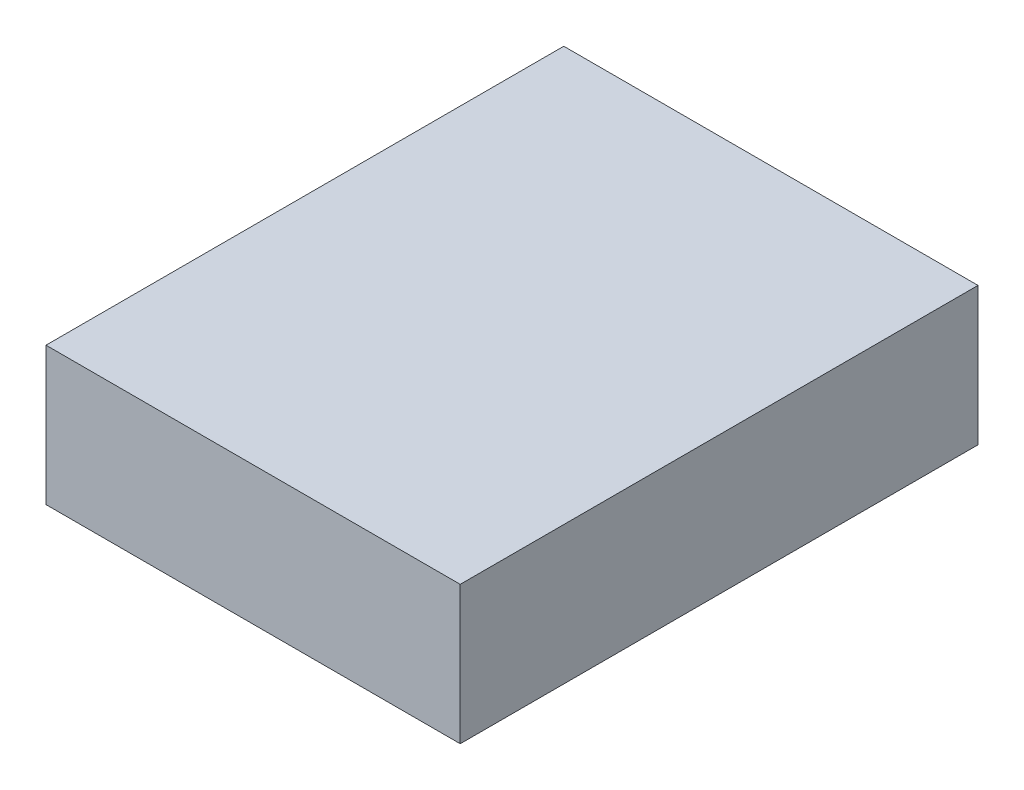
ISO-10303-21;
HEADER;
FILE_DESCRIPTION(('STEP AP214'),'2;1');
FILE_NAME('part.step','',(''),(''),'','','');
FILE_SCHEMA(('AUTOMOTIVE_DESIGN { 1 0 10303 214 1 1 1 1 }'));
ENDSEC;
DATA;
#1=APPLICATION_CONTEXT('core data for automotive mechanical design processes');
#2=APPLICATION_PROTOCOL_DEFINITION('international standard','automotive_design',2000,#1);
#3=PRODUCT_CONTEXT('',#1,'mechanical');
#4=PRODUCT('Part','Part','',(#3));
#5=PRODUCT_RELATED_PRODUCT_CATEGORY('part','',(#4));
#6=PRODUCT_DEFINITION_FORMATION('','',#4);
#7=PRODUCT_DEFINITION_CONTEXT('part definition',#1,'design');
#8=PRODUCT_DEFINITION('design','',#6,#7);
#9=PRODUCT_DEFINITION_SHAPE('','',#8);
#10=(LENGTH_UNIT() NAMED_UNIT(*) SI_UNIT(.MILLI.,.METRE.));
#11=(NAMED_UNIT(*) PLANE_ANGLE_UNIT() SI_UNIT($,.RADIAN.));
#12=(NAMED_UNIT(*) SI_UNIT($,.STERADIAN.) SOLID_ANGLE_UNIT());
#13=UNCERTAINTY_MEASURE_WITH_UNIT(LENGTH_MEASURE(1.E-05),#10,'distance_accuracy_value','');
#14=(GEOMETRIC_REPRESENTATION_CONTEXT(3) GLOBAL_UNCERTAINTY_ASSIGNED_CONTEXT((#13)) GLOBAL_UNIT_ASSIGNED_CONTEXT((#10,
#11,#12)) REPRESENTATION_CONTEXT('',''));
#15=CARTESIAN_POINT('',(0.,0.,0.));
#16=DIRECTION('',(0.,0.,1.));
#17=DIRECTION('',(1.,0.,0.));
#18=AXIS2_PLACEMENT_3D('',#15,#16,#17);
#19=CARTESIAN_POINT('',(30.,20.,37.5));
#20=DIRECTION('',(-1.,0.,0.));
#21=DIRECTION('',(0.,0.,1.));
#22=AXIS2_PLACEMENT_3D('',#19,#20,#21);
#23=PLANE('',#22);
#24=DIRECTION('',(0.,0.,-1.));
#25=VECTOR('',#24,1.);
#26=CARTESIAN_POINT('',(30.,0.,37.5));
#27=LINE('',#26,#25);
#28=CARTESIAN_POINT('',(30.,0.,37.5));
#29=VERTEX_POINT('',#28);
#30=CARTESIAN_POINT('',(30.,0.,-37.5));
#31=VERTEX_POINT('',#30);
#32=EDGE_CURVE('E113',#29,#31,#27,.T.);
#33=ORIENTED_EDGE('',*,*,#32,.T.);
#34=DIRECTION('',(0.,-1.,0.));
#35=VECTOR('',#34,1.);
#36=CARTESIAN_POINT('',(30.,20.,-37.5));
#37=LINE('',#36,#35);
#38=CARTESIAN_POINT('',(30.,20.,-37.5));
#39=VERTEX_POINT('',#38);
#40=EDGE_CURVE('E11',#39,#31,#37,.T.);
#41=ORIENTED_EDGE('',*,*,#40,.F.);
#42=DIRECTION('',(0.,0.,-1.));
#43=VECTOR('',#42,1.);
#44=CARTESIAN_POINT('',(30.,20.,37.5));
#45=LINE('',#44,#43);
#46=CARTESIAN_POINT('',(30.,20.,37.5));
#47=VERTEX_POINT('',#46);
#48=EDGE_CURVE('E97',#47,#39,#45,.T.);
#49=ORIENTED_EDGE('',*,*,#48,.F.);
#50=DIRECTION('',(0.,-1.,0.));
#51=VECTOR('',#50,1.);
#52=CARTESIAN_POINT('',(30.,20.,37.5));
#53=LINE('',#52,#51);
#54=EDGE_CURVE('E109',#47,#29,#53,.T.);
#55=ORIENTED_EDGE('',*,*,#54,.T.);
#56=EDGE_LOOP('',(#33,#41,#49,#55));
#57=FACE_BOUND('',#56,.T.);
#58=ADVANCED_FACE('F45',(#57),#23,.F.);
#59=CARTESIAN_POINT('',(-30.,20.,-37.5));
#60=DIRECTION('',(0.,0.,1.));
#61=DIRECTION('',(1.,0.,0.));
#62=AXIS2_PLACEMENT_3D('',#59,#60,#61);
#63=PLANE('',#62);
#64=DIRECTION('',(-1.,0.,0.));
#65=VECTOR('',#64,1.);
#66=CARTESIAN_POINT('',(-30.,0.,-37.5));
#67=LINE('',#66,#65);
#68=CARTESIAN_POINT('',(-30.,0.,-37.5));
#69=VERTEX_POINT('',#68);
#70=EDGE_CURVE('E102',#31,#69,#67,.T.);
#71=ORIENTED_EDGE('',*,*,#70,.T.);
#72=DIRECTION('',(0.,-1.,0.));
#73=VECTOR('',#72,1.);
#74=CARTESIAN_POINT('',(-30.,20.,-37.5));
#75=LINE('',#74,#73);
#76=CARTESIAN_POINT('',(-30.,20.,-37.5));
#77=VERTEX_POINT('',#76);
#78=EDGE_CURVE('E54',#77,#69,#75,.T.);
#79=ORIENTED_EDGE('',*,*,#78,.F.);
#80=DIRECTION('',(-1.,0.,0.));
#81=VECTOR('',#80,1.);
#82=CARTESIAN_POINT('',(-30.,20.,-37.5));
#83=LINE('',#82,#81);
#84=EDGE_CURVE('E92',#39,#77,#83,.T.);
#85=ORIENTED_EDGE('',*,*,#84,.F.);
#86=ORIENTED_EDGE('',*,*,#40,.T.);
#87=EDGE_LOOP('',(#71,#79,#85,#86));
#88=FACE_BOUND('',#87,.T.);
#89=ADVANCED_FACE('F101',(#88),#63,.F.);
#90=CARTESIAN_POINT('',(-30.,20.,37.5));
#91=DIRECTION('',(1.,0.,0.));
#92=DIRECTION('',(0.,0.,-1.));
#93=AXIS2_PLACEMENT_3D('',#90,#91,#92);
#94=PLANE('',#93);
#95=DIRECTION('',(0.,0.,1.));
#96=VECTOR('',#95,1.);
#97=CARTESIAN_POINT('',(-30.,0.,37.5));
#98=LINE('',#97,#96);
#99=CARTESIAN_POINT('',(-30.,0.,37.5));
#100=VERTEX_POINT('',#99);
#101=EDGE_CURVE('E79',#69,#100,#98,.T.);
#102=ORIENTED_EDGE('',*,*,#101,.T.);
#103=DIRECTION('',(0.,-1.,0.));
#104=VECTOR('',#103,1.);
#105=CARTESIAN_POINT('',(-30.,20.,37.5));
#106=LINE('',#105,#104);
#107=CARTESIAN_POINT('',(-30.,20.,37.5));
#108=VERTEX_POINT('',#107);
#109=EDGE_CURVE('E104',#108,#100,#106,.T.);
#110=ORIENTED_EDGE('',*,*,#109,.F.);
#111=DIRECTION('',(0.,0.,1.));
#112=VECTOR('',#111,1.);
#113=CARTESIAN_POINT('',(-30.,20.,37.5));
#114=LINE('',#113,#112);
#115=EDGE_CURVE('E95',#77,#108,#114,.T.);
#116=ORIENTED_EDGE('',*,*,#115,.F.);
#117=ORIENTED_EDGE('',*,*,#78,.T.);
#118=EDGE_LOOP('',(#102,#110,#116,#117));
#119=FACE_BOUND('',#118,.T.);
#120=ADVANCED_FACE('F105',(#119),#94,.F.);
#121=CARTESIAN_POINT('',(-30.,20.,37.5));
#122=DIRECTION('',(0.,0.,-1.));
#123=DIRECTION('',(-1.,0.,0.));
#124=AXIS2_PLACEMENT_3D('',#121,#122,#123);
#125=PLANE('',#124);
#126=DIRECTION('',(1.,0.,0.));
#127=VECTOR('',#126,1.);
#128=CARTESIAN_POINT('',(-30.,0.,37.5));
#129=LINE('',#128,#127);
#130=EDGE_CURVE('E85',#100,#29,#129,.T.);
#131=ORIENTED_EDGE('',*,*,#130,.T.);
#132=ORIENTED_EDGE('',*,*,#54,.F.);
#133=DIRECTION('',(1.,0.,0.));
#134=VECTOR('',#133,1.);
#135=CARTESIAN_POINT('',(-30.,20.,37.5));
#136=LINE('',#135,#134);
#137=EDGE_CURVE('E62',#108,#47,#136,.T.);
#138=ORIENTED_EDGE('',*,*,#137,.F.);
#139=ORIENTED_EDGE('',*,*,#109,.T.);
#140=EDGE_LOOP('',(#131,#132,#138,#139));
#141=FACE_BOUND('',#140,.T.);
#142=ADVANCED_FACE('F126',(#141),#125,.F.);
#143=CARTESIAN_POINT('',(0.,20.,0.));
#144=DIRECTION('',(0.,-1.,0.));
#145=DIRECTION('',(0.,0.,-1.));
#146=AXIS2_PLACEMENT_3D('',#143,#144,#145);
#147=PLANE('',#146);
#148=ORIENTED_EDGE('',*,*,#48,.T.);
#149=ORIENTED_EDGE('',*,*,#84,.T.);
#150=ORIENTED_EDGE('',*,*,#115,.T.);
#151=ORIENTED_EDGE('',*,*,#137,.T.);
#152=EDGE_LOOP('',(#148,#149,#150,#151));
#153=FACE_BOUND('',#152,.T.);
#154=ADVANCED_FACE('F93',(#153),#147,.F.);
#155=CARTESIAN_POINT('',(0.,0.,0.));
#156=DIRECTION('',(0.,-1.,0.));
#157=DIRECTION('',(0.,0.,-1.));
#158=AXIS2_PLACEMENT_3D('',#155,#156,#157);
#159=PLANE('',#158);
#160=ORIENTED_EDGE('',*,*,#32,.F.);
#161=ORIENTED_EDGE('',*,*,#130,.F.);
#162=ORIENTED_EDGE('',*,*,#101,.F.);
#163=ORIENTED_EDGE('',*,*,#70,.F.);
#164=EDGE_LOOP('',(#160,#161,#162,#163));
#165=FACE_BOUND('',#164,.T.);
#166=ADVANCED_FACE('F129',(#165),#159,.T.);
#167=CLOSED_SHELL('',(#58,#89,#120,#142,#154,#166));
#168=MANIFOLD_SOLID_BREP('B2',#167);
#169=ADVANCED_BREP_SHAPE_REPRESENTATION('',(#18,#168),#14);
#170=SHAPE_DEFINITION_REPRESENTATION(#9,#169);
ENDSEC;
END-ISO-10303-21;
